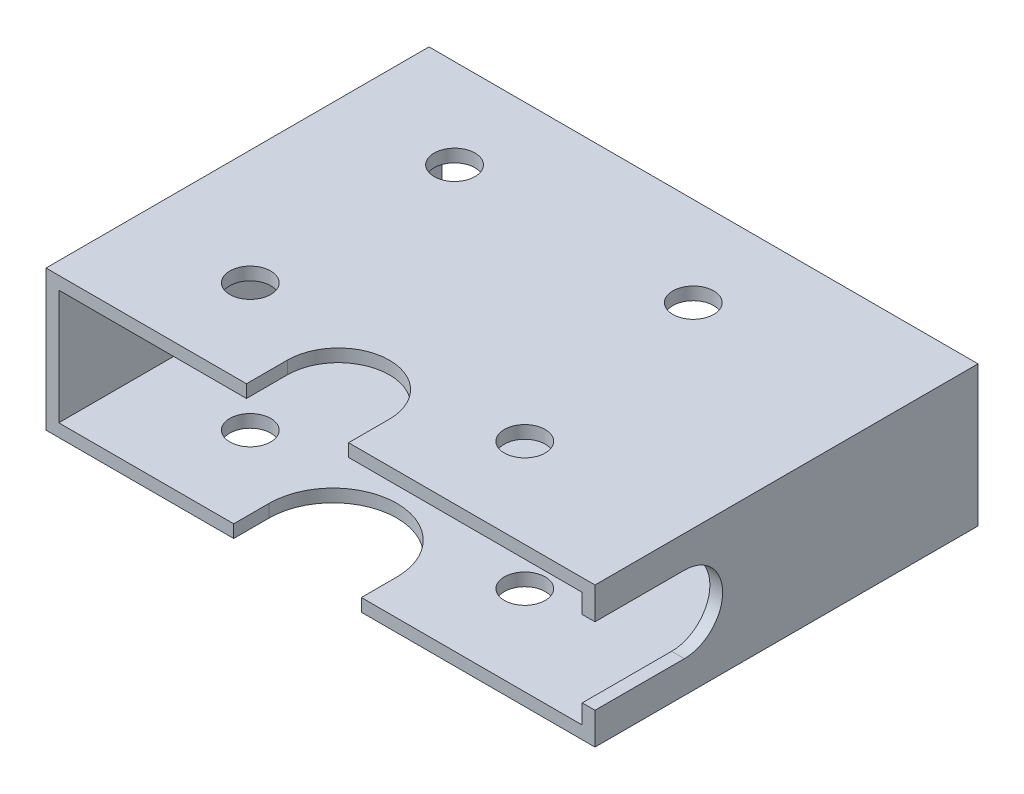
ISO-10303-21;
HEADER;
FILE_DESCRIPTION(('STEP AP214'),'2;1');
FILE_NAME('part.step','',(''),(''),'','','');
FILE_SCHEMA(('AUTOMOTIVE_DESIGN { 1 0 10303 214 1 1 1 1 }'));
ENDSEC;
DATA;
#1=APPLICATION_CONTEXT('core data for automotive mechanical design processes');
#2=APPLICATION_PROTOCOL_DEFINITION('international standard','automotive_design',2000,#1);
#3=PRODUCT_CONTEXT('',#1,'mechanical');
#4=PRODUCT('Part','Part','',(#3));
#5=PRODUCT_RELATED_PRODUCT_CATEGORY('part','',(#4));
#6=PRODUCT_DEFINITION_FORMATION('','',#4);
#7=PRODUCT_DEFINITION_CONTEXT('part definition',#1,'design');
#8=PRODUCT_DEFINITION('design','',#6,#7);
#9=PRODUCT_DEFINITION_SHAPE('','',#8);
#10=(LENGTH_UNIT() NAMED_UNIT(*) SI_UNIT(.MILLI.,.METRE.));
#11=(NAMED_UNIT(*) PLANE_ANGLE_UNIT() SI_UNIT($,.RADIAN.));
#12=(NAMED_UNIT(*) SI_UNIT($,.STERADIAN.) SOLID_ANGLE_UNIT());
#13=UNCERTAINTY_MEASURE_WITH_UNIT(LENGTH_MEASURE(1.E-05),#10,'distance_accuracy_value','');
#14=(GEOMETRIC_REPRESENTATION_CONTEXT(3) GLOBAL_UNCERTAINTY_ASSIGNED_CONTEXT((#13)) GLOBAL_UNIT_ASSIGNED_CONTEXT((#10,
#11,#12)) REPRESENTATION_CONTEXT('',''));
#15=CARTESIAN_POINT('',(0.,0.,0.));
#16=DIRECTION('',(0.,0.,1.));
#17=DIRECTION('',(1.,0.,0.));
#18=AXIS2_PLACEMENT_3D('',#15,#16,#17);
#19=CARTESIAN_POINT('',(0.,0.,30.));
#20=DIRECTION('',(0.,0.,-1.));
#21=DIRECTION('',(-1.,0.,0.));
#22=AXIS2_PLACEMENT_3D('',#19,#20,#21);
#23=PLANE('',#22);
#24=DIRECTION('',(0.,1.,0.));
#25=VECTOR('',#24,1.);
#26=CARTESIAN_POINT('',(-1.,0.999999999999997,30.));
#27=LINE('',#26,#25);
#28=CARTESIAN_POINT('',(-1.,8.5,30.));
#29=VERTEX_POINT('',#28);
#30=CARTESIAN_POINT('',(-1.,10.,30.));
#31=VERTEX_POINT('',#30);
#32=EDGE_CURVE('E273',#29,#31,#27,.T.);
#33=ORIENTED_EDGE('',*,*,#32,.F.);
#34=DIRECTION('',(1.,0.,0.));
#35=VECTOR('',#34,1.);
#36=CARTESIAN_POINT('',(-10.,8.5,30.));
#37=LINE('',#36,#35);
#38=CARTESIAN_POINT('',(0.,8.5,30.));
#39=VERTEX_POINT('',#38);
#40=EDGE_CURVE('E490',#29,#39,#37,.T.);
#41=ORIENTED_EDGE('',*,*,#40,.T.);
#42=DIRECTION('',(0.,1.,0.));
#43=VECTOR('',#42,1.);
#44=CARTESIAN_POINT('',(0.,1.,30.));
#45=LINE('',#44,#43);
#46=CARTESIAN_POINT('',(0.,11.,30.));
#47=VERTEX_POINT('',#46);
#48=EDGE_CURVE('E201',#39,#47,#45,.T.);
#49=ORIENTED_EDGE('',*,*,#48,.T.);
#50=DIRECTION('',(-1.,0.,0.));
#51=VECTOR('',#50,1.);
#52=CARTESIAN_POINT('',(-43.,11.,30.));
#53=LINE('',#52,#51);
#54=CARTESIAN_POINT('',(-19.3,11.,30.));
#55=VERTEX_POINT('',#54);
#56=EDGE_CURVE('E203',#47,#55,#53,.T.);
#57=ORIENTED_EDGE('',*,*,#56,.T.);
#58=DIRECTION('',(0.,1.,0.));
#59=VECTOR('',#58,1.);
#60=CARTESIAN_POINT('',(-19.3,9.,30.));
#61=LINE('',#60,#59);
#62=CARTESIAN_POINT('',(-19.3,10.,30.));
#63=VERTEX_POINT('',#62);
#64=EDGE_CURVE('E360',#63,#55,#61,.T.);
#65=ORIENTED_EDGE('',*,*,#64,.F.);
#66=DIRECTION('',(-1.,0.,0.));
#67=VECTOR('',#66,1.);
#68=CARTESIAN_POINT('',(-1.,10.,30.));
#69=LINE('',#68,#67);
#70=EDGE_CURVE('E275',#31,#63,#69,.T.);
#71=ORIENTED_EDGE('',*,*,#70,.F.);
#72=EDGE_LOOP('',(#33,#41,#49,#57,#65,#71));
#73=FACE_BOUND('',#72,.T.);
#74=ADVANCED_FACE('F38',(#73),#23,.F.);
#75=CARTESIAN_POINT('',(0.,0.,30.));
#76=VERTEX_POINT('',#75);
#77=CARTESIAN_POINT('',(0.,2.5,30.));
#78=VERTEX_POINT('',#77);
#79=EDGE_CURVE('E190',#76,#78,#45,.T.);
#80=ORIENTED_EDGE('',*,*,#79,.T.);
#81=DIRECTION('',(1.,0.,0.));
#82=VECTOR('',#81,1.);
#83=CARTESIAN_POINT('',(-10.,2.5,30.));
#84=LINE('',#83,#82);
#85=CARTESIAN_POINT('',(-1.,2.5,30.));
#86=VERTEX_POINT('',#85);
#87=EDGE_CURVE('E173',#86,#78,#84,.T.);
#88=ORIENTED_EDGE('',*,*,#87,.F.);
#89=CARTESIAN_POINT('',(-1.,0.999999999999997,30.));
#90=VERTEX_POINT('',#89);
#91=EDGE_CURVE('E268',#90,#86,#27,.T.);
#92=ORIENTED_EDGE('',*,*,#91,.F.);
#93=DIRECTION('',(1.,0.,0.));
#94=VECTOR('',#93,1.);
#95=CARTESIAN_POINT('',(-42.,0.999999999999995,30.));
#96=LINE('',#95,#94);
#97=CARTESIAN_POINT('',(-18.3,0.999999999999996,30.));
#98=VERTEX_POINT('',#97);
#99=EDGE_CURVE('E285',#98,#90,#96,.T.);
#100=ORIENTED_EDGE('',*,*,#99,.F.);
#101=DIRECTION('',(0.,1.,0.));
#102=VECTOR('',#101,1.);
#103=CARTESIAN_POINT('',(-18.3,-9.00000000000001,30.));
#104=LINE('',#103,#102);
#105=CARTESIAN_POINT('',(-18.3,0.,30.));
#106=VERTEX_POINT('',#105);
#107=EDGE_CURVE('E319',#106,#98,#104,.T.);
#108=ORIENTED_EDGE('',*,*,#107,.F.);
#109=DIRECTION('',(1.,0.,0.));
#110=VECTOR('',#109,1.);
#111=CARTESIAN_POINT('',(0.,0.,30.));
#112=LINE('',#111,#110);
#113=EDGE_CURVE('E198',#106,#76,#112,.T.);
#114=ORIENTED_EDGE('',*,*,#113,.T.);
#115=EDGE_LOOP('',(#80,#88,#92,#100,#108,#114));
#116=FACE_BOUND('',#115,.T.);
#117=ADVANCED_FACE('F195',(#116),#23,.F.);
#118=CARTESIAN_POINT('',(-43.,0.,30.));
#119=VERTEX_POINT('',#118);
#120=CARTESIAN_POINT('',(-28.3,0.,30.));
#121=VERTEX_POINT('',#120);
#122=EDGE_CURVE('E213',#119,#121,#112,.T.);
#123=ORIENTED_EDGE('',*,*,#122,.T.);
#124=DIRECTION('',(0.,1.,0.));
#125=VECTOR('',#124,1.);
#126=CARTESIAN_POINT('',(-28.3,-9.00000000000001,30.));
#127=LINE('',#126,#125);
#128=CARTESIAN_POINT('',(-28.3,0.999999999999996,30.));
#129=VERTEX_POINT('',#128);
#130=EDGE_CURVE('E322',#121,#129,#127,.T.);
#131=ORIENTED_EDGE('',*,*,#130,.T.);
#132=CARTESIAN_POINT('',(-42.,0.999999999999995,30.));
#133=VERTEX_POINT('',#132);
#134=EDGE_CURVE('E286',#133,#129,#96,.T.);
#135=ORIENTED_EDGE('',*,*,#134,.F.);
#136=DIRECTION('',(0.,-1.,0.));
#137=VECTOR('',#136,1.);
#138=CARTESIAN_POINT('',(-42.,9.99999999999999,30.));
#139=LINE('',#138,#137);
#140=CARTESIAN_POINT('',(-42.,9.99999999999999,30.));
#141=VERTEX_POINT('',#140);
#142=EDGE_CURVE('E282',#141,#133,#139,.T.);
#143=ORIENTED_EDGE('',*,*,#142,.F.);
#144=CARTESIAN_POINT('',(-27.3,10.,30.));
#145=VERTEX_POINT('',#144);
#146=EDGE_CURVE('E272',#145,#141,#69,.T.);
#147=ORIENTED_EDGE('',*,*,#146,.F.);
#148=DIRECTION('',(0.,1.,0.));
#149=VECTOR('',#148,1.);
#150=CARTESIAN_POINT('',(-27.3,8.99999999999999,30.));
#151=LINE('',#150,#149);
#152=CARTESIAN_POINT('',(-27.3,11.,30.));
#153=VERTEX_POINT('',#152);
#154=EDGE_CURVE('E353',#145,#153,#151,.T.);
#155=ORIENTED_EDGE('',*,*,#154,.T.);
#156=CARTESIAN_POINT('',(-43.,11.,30.));
#157=VERTEX_POINT('',#156);
#158=EDGE_CURVE('E200',#153,#157,#53,.T.);
#159=ORIENTED_EDGE('',*,*,#158,.T.);
#160=DIRECTION('',(0.,-1.,0.));
#161=VECTOR('',#160,1.);
#162=CARTESIAN_POINT('',(-43.,0.,30.));
#163=LINE('',#162,#161);
#164=EDGE_CURVE('E211',#157,#119,#163,.T.);
#165=ORIENTED_EDGE('',*,*,#164,.T.);
#166=EDGE_LOOP('',(#123,#131,#135,#143,#147,#155,#159,#165));
#167=FACE_BOUND('',#166,.T.);
#168=ADVANCED_FACE('F349',(#167),#23,.F.);
#169=CARTESIAN_POINT('',(0.,0.,0.));
#170=DIRECTION('',(0.,0.,-1.));
#171=DIRECTION('',(-1.,0.,0.));
#172=AXIS2_PLACEMENT_3D('',#169,#170,#171);
#173=PLANE('',#172);
#174=DIRECTION('',(0.,1.,0.));
#175=VECTOR('',#174,1.);
#176=CARTESIAN_POINT('',(0.,11.,0.));
#177=LINE('',#176,#175);
#178=CARTESIAN_POINT('',(0.,0.,0.));
#179=VERTEX_POINT('',#178);
#180=CARTESIAN_POINT('',(0.,11.,0.));
#181=VERTEX_POINT('',#180);
#182=EDGE_CURVE('E217',#179,#181,#177,.T.);
#183=ORIENTED_EDGE('',*,*,#182,.F.);
#184=DIRECTION('',(1.,0.,0.));
#185=VECTOR('',#184,1.);
#186=CARTESIAN_POINT('',(0.,0.,0.));
#187=LINE('',#186,#185);
#188=CARTESIAN_POINT('',(-43.,0.,0.));
#189=VERTEX_POINT('',#188);
#190=EDGE_CURVE('E205',#189,#179,#187,.T.);
#191=ORIENTED_EDGE('',*,*,#190,.F.);
#192=DIRECTION('',(0.,-1.,0.));
#193=VECTOR('',#192,1.);
#194=CARTESIAN_POINT('',(-43.,0.,0.));
#195=LINE('',#194,#193);
#196=CARTESIAN_POINT('',(-43.,11.,0.));
#197=VERTEX_POINT('',#196);
#198=EDGE_CURVE('E221',#197,#189,#195,.T.);
#199=ORIENTED_EDGE('',*,*,#198,.F.);
#200=DIRECTION('',(-1.,0.,0.));
#201=VECTOR('',#200,1.);
#202=CARTESIAN_POINT('',(-43.,11.,0.));
#203=LINE('',#202,#201);
#204=EDGE_CURVE('E219',#181,#197,#203,.T.);
#205=ORIENTED_EDGE('',*,*,#204,.F.);
#206=EDGE_LOOP('',(#183,#191,#199,#205));
#207=FACE_BOUND('',#206,.T.);
#208=DIRECTION('',(1.,0.,0.));
#209=VECTOR('',#208,1.);
#210=CARTESIAN_POINT('',(-42.,0.999999999999995,0.));
#211=LINE('',#210,#209);
#212=CARTESIAN_POINT('',(-42.,0.999999999999995,0.));
#213=VERTEX_POINT('',#212);
#214=CARTESIAN_POINT('',(-1.,0.999999999999997,0.));
#215=VERTEX_POINT('',#214);
#216=EDGE_CURVE('E277',#213,#215,#211,.T.);
#217=ORIENTED_EDGE('',*,*,#216,.T.);
#218=DIRECTION('',(0.,1.,0.));
#219=VECTOR('',#218,1.);
#220=CARTESIAN_POINT('',(-1.,0.999999999999997,0.));
#221=LINE('',#220,#219);
#222=CARTESIAN_POINT('',(-1.,10.,0.));
#223=VERTEX_POINT('',#222);
#224=EDGE_CURVE('E289',#215,#223,#221,.T.);
#225=ORIENTED_EDGE('',*,*,#224,.T.);
#226=DIRECTION('',(-1.,0.,0.));
#227=VECTOR('',#226,1.);
#228=CARTESIAN_POINT('',(-1.,10.,0.));
#229=LINE('',#228,#227);
#230=CARTESIAN_POINT('',(-42.,9.99999999999999,0.));
#231=VERTEX_POINT('',#230);
#232=EDGE_CURVE('E292',#223,#231,#229,.T.);
#233=ORIENTED_EDGE('',*,*,#232,.T.);
#234=DIRECTION('',(0.,-1.,0.));
#235=VECTOR('',#234,1.);
#236=CARTESIAN_POINT('',(-42.,9.99999999999999,0.));
#237=LINE('',#236,#235);
#238=EDGE_CURVE('E295',#231,#213,#237,.T.);
#239=ORIENTED_EDGE('',*,*,#238,.T.);
#240=EDGE_LOOP('',(#217,#225,#233,#239));
#241=FACE_BOUND('',#240,.T.);
#242=ADVANCED_FACE('F311',(#207,#241),#173,.T.);
#243=CARTESIAN_POINT('',(0.,11.,30.));
#244=DIRECTION('',(-1.,0.,0.));
#245=DIRECTION('',(0.,-1.,0.));
#246=AXIS2_PLACEMENT_3D('',#243,#244,#245);
#247=PLANE('',#246);
#248=ORIENTED_EDGE('',*,*,#48,.F.);
#249=DIRECTION('',(0.,0.,1.));
#250=VECTOR('',#249,1.);
#251=CARTESIAN_POINT('',(0.,8.5,23.));
#252=LINE('',#251,#250);
#253=CARTESIAN_POINT('',(0.,8.5,23.));
#254=VERTEX_POINT('',#253);
#255=EDGE_CURVE('E184',#254,#39,#252,.T.);
#256=ORIENTED_EDGE('',*,*,#255,.F.);
#257=CARTESIAN_POINT('',(0.,5.5,23.));
#258=DIRECTION('',(1.,0.,0.));
#259=DIRECTION('',(0.,1.,0.));
#260=AXIS2_PLACEMENT_3D('',#257,#258,#259);
#261=CIRCLE('',#260,3.);
#262=CARTESIAN_POINT('',(0.,2.5,23.));
#263=VERTEX_POINT('',#262);
#264=EDGE_CURVE('E193',#263,#254,#261,.T.);
#265=ORIENTED_EDGE('',*,*,#264,.F.);
#266=DIRECTION('',(0.,0.,-1.));
#267=VECTOR('',#266,1.);
#268=CARTESIAN_POINT('',(0.,2.5,23.));
#269=LINE('',#268,#267);
#270=EDGE_CURVE('E176',#78,#263,#269,.T.);
#271=ORIENTED_EDGE('',*,*,#270,.F.);
#272=ORIENTED_EDGE('',*,*,#79,.F.);
#273=DIRECTION('',(0.,0.,-1.));
#274=VECTOR('',#273,1.);
#275=CARTESIAN_POINT('',(0.,0.,30.));
#276=LINE('',#275,#274);
#277=EDGE_CURVE('E216',#76,#179,#276,.T.);
#278=ORIENTED_EDGE('',*,*,#277,.T.);
#279=ORIENTED_EDGE('',*,*,#182,.T.);
#280=DIRECTION('',(0.,0.,-1.));
#281=VECTOR('',#280,1.);
#282=CARTESIAN_POINT('',(0.,11.,30.));
#283=LINE('',#282,#281);
#284=EDGE_CURVE('E232',#47,#181,#283,.T.);
#285=ORIENTED_EDGE('',*,*,#284,.F.);
#286=EDGE_LOOP('',(#248,#256,#265,#271,#272,#278,#279,#285));
#287=FACE_BOUND('',#286,.T.);
#288=ADVANCED_FACE('F40',(#287),#247,.F.);
#289=CARTESIAN_POINT('',(-43.,11.,30.));
#290=DIRECTION('',(0.,-1.,0.));
#291=DIRECTION('',(1.,0.,0.));
#292=AXIS2_PLACEMENT_3D('',#289,#290,#291);
#293=PLANE('',#292);
#294=CARTESIAN_POINT('',(-15.3,11.,7.));
#295=DIRECTION('',(0.,1.,0.));
#296=DIRECTION('',(0.,0.,-1.));
#297=AXIS2_PLACEMENT_3D('',#294,#295,#296);
#298=CIRCLE('',#297,1.6);
#299=CARTESIAN_POINT('',(-15.3,11.,5.4));
#300=VERTEX_POINT('',#299);
#301=EDGE_CURVE('E369',#300,#300,#298,.T.);
#302=ORIENTED_EDGE('',*,*,#301,.F.);
#303=EDGE_LOOP('',(#302));
#304=FACE_BOUND('',#303,.T.);
#305=CARTESIAN_POINT('',(-12.5,11.,23.));
#306=DIRECTION('',(0.,1.,0.));
#307=DIRECTION('',(0.,0.,1.));
#308=AXIS2_PLACEMENT_3D('',#305,#306,#307);
#309=CIRCLE('',#308,1.6);
#310=CARTESIAN_POINT('',(-12.5,11.,24.6));
#311=VERTEX_POINT('',#310);
#312=EDGE_CURVE('E383',#311,#311,#309,.T.);
#313=ORIENTED_EDGE('',*,*,#312,.F.);
#314=EDGE_LOOP('',(#313));
#315=FACE_BOUND('',#314,.T.);
#316=CARTESIAN_POINT('',(-34.,11.,23.));
#317=DIRECTION('',(0.,1.,0.));
#318=DIRECTION('',(0.,0.,1.));
#319=AXIS2_PLACEMENT_3D('',#316,#317,#318);
#320=CIRCLE('',#319,1.6);
#321=CARTESIAN_POINT('',(-34.,11.,24.6));
#322=VERTEX_POINT('',#321);
#323=EDGE_CURVE('E377',#322,#322,#320,.T.);
#324=ORIENTED_EDGE('',*,*,#323,.F.);
#325=EDGE_LOOP('',(#324));
#326=FACE_BOUND('',#325,.T.);
#327=CARTESIAN_POINT('',(-34.,11.,7.));
#328=DIRECTION('',(0.,1.,0.));
#329=DIRECTION('',(0.,0.,1.));
#330=AXIS2_PLACEMENT_3D('',#327,#328,#329);
#331=CIRCLE('',#330,1.60000000000001);
#332=CARTESIAN_POINT('',(-34.,11.,8.6));
#333=VERTEX_POINT('',#332);
#334=EDGE_CURVE('E376',#333,#333,#331,.T.);
#335=ORIENTED_EDGE('',*,*,#334,.F.);
#336=EDGE_LOOP('',(#335));
#337=FACE_BOUND('',#336,.T.);
#338=ORIENTED_EDGE('',*,*,#158,.F.);
#339=DIRECTION('',(0.,0.,1.));
#340=VECTOR('',#339,1.);
#341=CARTESIAN_POINT('',(-27.3,11.,30.));
#342=LINE('',#341,#340);
#343=CARTESIAN_POINT('',(-27.3,11.,26.8));
#344=VERTEX_POINT('',#343);
#345=EDGE_CURVE('E356',#344,#153,#342,.T.);
#346=ORIENTED_EDGE('',*,*,#345,.F.);
#347=CARTESIAN_POINT('',(-23.3,11.,26.8));
#348=DIRECTION('',(0.,1.,0.));
#349=DIRECTION('',(1.,0.,0.));
#350=AXIS2_PLACEMENT_3D('',#347,#348,#349);
#351=CIRCLE('',#350,4.);
#352=CARTESIAN_POINT('',(-19.3,11.,26.8));
#353=VERTEX_POINT('',#352);
#354=EDGE_CURVE('E358',#353,#344,#351,.T.);
#355=ORIENTED_EDGE('',*,*,#354,.F.);
#356=DIRECTION('',(0.,0.,-1.));
#357=VECTOR('',#356,1.);
#358=CARTESIAN_POINT('',(-19.3,11.,30.));
#359=LINE('',#358,#357);
#360=EDGE_CURVE('E364',#55,#353,#359,.T.);
#361=ORIENTED_EDGE('',*,*,#360,.F.);
#362=ORIENTED_EDGE('',*,*,#56,.F.);
#363=ORIENTED_EDGE('',*,*,#284,.T.);
#364=ORIENTED_EDGE('',*,*,#204,.T.);
#365=DIRECTION('',(0.,0.,-1.));
#366=VECTOR('',#365,1.);
#367=CARTESIAN_POINT('',(-43.,11.,30.));
#368=LINE('',#367,#366);
#369=EDGE_CURVE('E229',#157,#197,#368,.T.);
#370=ORIENTED_EDGE('',*,*,#369,.F.);
#371=EDGE_LOOP('',(#338,#346,#355,#361,#362,#363,#364,#370));
#372=FACE_BOUND('',#371,.T.);
#373=ADVANCED_FACE('F336',(#304,#315,#326,#337,#372),#293,.F.);
#374=CARTESIAN_POINT('',(-43.,0.,30.));
#375=DIRECTION('',(1.,0.,0.));
#376=DIRECTION('',(0.,0.,-1.));
#377=AXIS2_PLACEMENT_3D('',#374,#375,#376);
#378=PLANE('',#377);
#379=ORIENTED_EDGE('',*,*,#198,.T.);
#380=DIRECTION('',(0.,0.,-1.));
#381=VECTOR('',#380,1.);
#382=CARTESIAN_POINT('',(-43.,0.,30.));
#383=LINE('',#382,#381);
#384=EDGE_CURVE('E226',#119,#189,#383,.T.);
#385=ORIENTED_EDGE('',*,*,#384,.F.);
#386=ORIENTED_EDGE('',*,*,#164,.F.);
#387=ORIENTED_EDGE('',*,*,#369,.T.);
#388=EDGE_LOOP('',(#379,#385,#386,#387));
#389=FACE_BOUND('',#388,.T.);
#390=ADVANCED_FACE('F342',(#389),#378,.F.);
#391=CARTESIAN_POINT('',(0.,0.,30.));
#392=DIRECTION('',(0.,1.,0.));
#393=DIRECTION('',(-1.,0.,0.));
#394=AXIS2_PLACEMENT_3D('',#391,#392,#393);
#395=PLANE('',#394);
#396=CARTESIAN_POINT('',(-15.3,0.,7.));
#397=DIRECTION('',(0.,1.,0.));
#398=DIRECTION('',(0.,0.,-1.));
#399=AXIS2_PLACEMENT_3D('',#396,#397,#398);
#400=CIRCLE('',#399,1.6);
#401=CARTESIAN_POINT('',(-15.3,0.,5.4));
#402=VERTEX_POINT('',#401);
#403=EDGE_CURVE('E386',#402,#402,#400,.T.);
#404=ORIENTED_EDGE('',*,*,#403,.T.);
#405=EDGE_LOOP('',(#404));
#406=FACE_BOUND('',#405,.T.);
#407=CARTESIAN_POINT('',(-12.5,0.,23.));
#408=DIRECTION('',(0.,1.,0.));
#409=DIRECTION('',(0.,0.,1.));
#410=AXIS2_PLACEMENT_3D('',#407,#408,#409);
#411=CIRCLE('',#410,1.6);
#412=CARTESIAN_POINT('',(-12.5,0.,24.6));
#413=VERTEX_POINT('',#412);
#414=EDGE_CURVE('E380',#413,#413,#411,.T.);
#415=ORIENTED_EDGE('',*,*,#414,.T.);
#416=EDGE_LOOP('',(#415));
#417=FACE_BOUND('',#416,.T.);
#418=CARTESIAN_POINT('',(-34.,0.,23.));
#419=DIRECTION('',(0.,1.,0.));
#420=DIRECTION('',(0.,0.,1.));
#421=AXIS2_PLACEMENT_3D('',#418,#419,#420);
#422=CIRCLE('',#421,1.6);
#423=CARTESIAN_POINT('',(-34.,0.,24.6));
#424=VERTEX_POINT('',#423);
#425=EDGE_CURVE('E373',#424,#424,#422,.T.);
#426=ORIENTED_EDGE('',*,*,#425,.T.);
#427=EDGE_LOOP('',(#426));
#428=FACE_BOUND('',#427,.T.);
#429=CARTESIAN_POINT('',(-34.,0.,7.));
#430=DIRECTION('',(0.,1.,0.));
#431=DIRECTION('',(0.,0.,1.));
#432=AXIS2_PLACEMENT_3D('',#429,#430,#431);
#433=CIRCLE('',#432,1.60000000000001);
#434=CARTESIAN_POINT('',(-34.,0.,8.6));
#435=VERTEX_POINT('',#434);
#436=EDGE_CURVE('E240',#435,#435,#433,.T.);
#437=ORIENTED_EDGE('',*,*,#436,.T.);
#438=EDGE_LOOP('',(#437));
#439=FACE_BOUND('',#438,.T.);
#440=ORIENTED_EDGE('',*,*,#113,.F.);
#441=DIRECTION('',(0.,0.,-1.));
#442=VECTOR('',#441,1.);
#443=CARTESIAN_POINT('',(-18.3,0.,30.));
#444=LINE('',#443,#442);
#445=CARTESIAN_POINT('',(-18.3,0.,27.2207204187685));
#446=VERTEX_POINT('',#445);
#447=EDGE_CURVE('E328',#106,#446,#444,.T.);
#448=ORIENTED_EDGE('',*,*,#447,.T.);
#449=CARTESIAN_POINT('',(-23.3,0.,27.2207204187685));
#450=DIRECTION('',(0.,1.,0.));
#451=DIRECTION('',(-1.,0.,0.));
#452=AXIS2_PLACEMENT_3D('',#449,#450,#451);
#453=CIRCLE('',#452,5.);
#454=CARTESIAN_POINT('',(-28.3,0.,27.2207204187685));
#455=VERTEX_POINT('',#454);
#456=EDGE_CURVE('E498',#446,#455,#453,.T.);
#457=ORIENTED_EDGE('',*,*,#456,.T.);
#458=DIRECTION('',(0.,0.,1.));
#459=VECTOR('',#458,1.);
#460=CARTESIAN_POINT('',(-28.3,0.,30.));
#461=LINE('',#460,#459);
#462=EDGE_CURVE('E346',#455,#121,#461,.T.);
#463=ORIENTED_EDGE('',*,*,#462,.T.);
#464=ORIENTED_EDGE('',*,*,#122,.F.);
#465=ORIENTED_EDGE('',*,*,#384,.T.);
#466=ORIENTED_EDGE('',*,*,#190,.T.);
#467=ORIENTED_EDGE('',*,*,#277,.F.);
#468=EDGE_LOOP('',(#440,#448,#457,#463,#464,#465,#466,#467));
#469=FACE_BOUND('',#468,.T.);
#470=ADVANCED_FACE('F326',(#406,#417,#428,#439,#469),#395,.F.);
#471=CARTESIAN_POINT('',(-1.,0.999999999999997,30.));
#472=DIRECTION('',(-1.,0.,0.));
#473=DIRECTION('',(0.,-1.,0.));
#474=AXIS2_PLACEMENT_3D('',#471,#472,#473);
#475=PLANE('',#474);
#476=DIRECTION('',(0.,0.,-1.));
#477=VECTOR('',#476,1.);
#478=CARTESIAN_POINT('',(-1.,8.5,30.));
#479=LINE('',#478,#477);
#480=CARTESIAN_POINT('',(-1.,8.5,23.));
#481=VERTEX_POINT('',#480);
#482=EDGE_CURVE('E11',#29,#481,#479,.T.);
#483=ORIENTED_EDGE('',*,*,#482,.F.);
#484=ORIENTED_EDGE('',*,*,#32,.T.);
#485=DIRECTION('',(0.,0.,-1.));
#486=VECTOR('',#485,1.);
#487=CARTESIAN_POINT('',(-1.,10.,30.));
#488=LINE('',#487,#486);
#489=EDGE_CURVE('E207',#31,#223,#488,.T.);
#490=ORIENTED_EDGE('',*,*,#489,.T.);
#491=ORIENTED_EDGE('',*,*,#224,.F.);
#492=DIRECTION('',(0.,0.,-1.));
#493=VECTOR('',#492,1.);
#494=CARTESIAN_POINT('',(-1.,0.999999999999997,30.));
#495=LINE('',#494,#493);
#496=EDGE_CURVE('E270',#90,#215,#495,.T.);
#497=ORIENTED_EDGE('',*,*,#496,.F.);
#498=ORIENTED_EDGE('',*,*,#91,.T.);
#499=DIRECTION('',(0.,0.,1.));
#500=VECTOR('',#499,1.);
#501=CARTESIAN_POINT('',(-1.,2.5,30.));
#502=LINE('',#501,#500);
#503=CARTESIAN_POINT('',(-1.,2.5,23.));
#504=VERTEX_POINT('',#503);
#505=EDGE_CURVE('E179',#504,#86,#502,.T.);
#506=ORIENTED_EDGE('',*,*,#505,.F.);
#507=CARTESIAN_POINT('',(-1.,5.5,23.));
#508=DIRECTION('',(-1.,0.,0.));
#509=DIRECTION('',(0.,-1.,0.));
#510=AXIS2_PLACEMENT_3D('',#507,#508,#509);
#511=CIRCLE('',#510,3.);
#512=EDGE_CURVE('E46',#481,#504,#511,.T.);
#513=ORIENTED_EDGE('',*,*,#512,.F.);
#514=EDGE_LOOP('',(#483,#484,#490,#491,#497,#498,#506,#513));
#515=FACE_BOUND('',#514,.T.);
#516=ADVANCED_FACE('F266',(#515),#475,.T.);
#517=CARTESIAN_POINT('',(-1.,10.,30.));
#518=DIRECTION('',(0.,-1.,0.));
#519=DIRECTION('',(1.,0.,0.));
#520=AXIS2_PLACEMENT_3D('',#517,#518,#519);
#521=PLANE('',#520);
#522=DIRECTION('',(0.,0.,-1.));
#523=VECTOR('',#522,1.);
#524=CARTESIAN_POINT('',(-27.3,10.,30.));
#525=LINE('',#524,#523);
#526=CARTESIAN_POINT('',(-27.3,10.,26.8));
#527=VERTEX_POINT('',#526);
#528=EDGE_CURVE('E257',#145,#527,#525,.T.);
#529=ORIENTED_EDGE('',*,*,#528,.F.);
#530=ORIENTED_EDGE('',*,*,#146,.T.);
#531=DIRECTION('',(0.,0.,-1.));
#532=VECTOR('',#531,1.);
#533=CARTESIAN_POINT('',(-42.,9.99999999999999,30.));
#534=LINE('',#533,#532);
#535=EDGE_CURVE('E302',#141,#231,#534,.T.);
#536=ORIENTED_EDGE('',*,*,#535,.T.);
#537=ORIENTED_EDGE('',*,*,#232,.F.);
#538=ORIENTED_EDGE('',*,*,#489,.F.);
#539=ORIENTED_EDGE('',*,*,#70,.T.);
#540=DIRECTION('',(0.,0.,1.));
#541=VECTOR('',#540,1.);
#542=CARTESIAN_POINT('',(-19.3,10.,30.));
#543=LINE('',#542,#541);
#544=CARTESIAN_POINT('',(-19.3,10.,26.8));
#545=VERTEX_POINT('',#544);
#546=EDGE_CURVE('E235',#545,#63,#543,.T.);
#547=ORIENTED_EDGE('',*,*,#546,.F.);
#548=CARTESIAN_POINT('',(-23.3,10.,26.8));
#549=DIRECTION('',(0.,-1.,0.));
#550=DIRECTION('',(1.,0.,0.));
#551=AXIS2_PLACEMENT_3D('',#548,#549,#550);
#552=CIRCLE('',#551,4.);
#553=EDGE_CURVE('E254',#527,#545,#552,.T.);
#554=ORIENTED_EDGE('',*,*,#553,.F.);
#555=EDGE_LOOP('',(#529,#530,#536,#537,#538,#539,#547,#554));
#556=FACE_BOUND('',#555,.T.);
#557=CARTESIAN_POINT('',(-15.3,10.,7.));
#558=DIRECTION('',(0.,-1.,0.));
#559=DIRECTION('',(1.,0.,0.));
#560=AXIS2_PLACEMENT_3D('',#557,#558,#559);
#561=CIRCLE('',#560,1.6);
#562=CARTESIAN_POINT('',(-13.7,10.,7.));
#563=VERTEX_POINT('',#562);
#564=EDGE_CURVE('E252',#563,#563,#561,.T.);
#565=ORIENTED_EDGE('',*,*,#564,.F.);
#566=EDGE_LOOP('',(#565));
#567=FACE_BOUND('',#566,.T.);
#568=CARTESIAN_POINT('',(-12.5,10.,23.));
#569=DIRECTION('',(0.,-1.,0.));
#570=DIRECTION('',(1.,0.,0.));
#571=AXIS2_PLACEMENT_3D('',#568,#569,#570);
#572=CIRCLE('',#571,1.6);
#573=CARTESIAN_POINT('',(-10.9,10.,23.));
#574=VERTEX_POINT('',#573);
#575=EDGE_CURVE('E248',#574,#574,#572,.T.);
#576=ORIENTED_EDGE('',*,*,#575,.F.);
#577=EDGE_LOOP('',(#576));
#578=FACE_BOUND('',#577,.T.);
#579=CARTESIAN_POINT('',(-34.,9.99999999999999,23.));
#580=DIRECTION('',(0.,-1.,0.));
#581=DIRECTION('',(1.,0.,0.));
#582=AXIS2_PLACEMENT_3D('',#579,#580,#581);
#583=CIRCLE('',#582,1.6);
#584=CARTESIAN_POINT('',(-32.4,9.99999999999999,23.));
#585=VERTEX_POINT('',#584);
#586=EDGE_CURVE('E244',#585,#585,#583,.T.);
#587=ORIENTED_EDGE('',*,*,#586,.F.);
#588=EDGE_LOOP('',(#587));
#589=FACE_BOUND('',#588,.T.);
#590=CARTESIAN_POINT('',(-34.,9.99999999999999,7.));
#591=DIRECTION('',(0.,-1.,0.));
#592=DIRECTION('',(1.,0.,0.));
#593=AXIS2_PLACEMENT_3D('',#590,#591,#592);
#594=CIRCLE('',#593,1.60000000000001);
#595=CARTESIAN_POINT('',(-32.4,9.99999999999999,7.));
#596=VERTEX_POINT('',#595);
#597=EDGE_CURVE('E239',#596,#596,#594,.T.);
#598=ORIENTED_EDGE('',*,*,#597,.F.);
#599=EDGE_LOOP('',(#598));
#600=FACE_BOUND('',#599,.T.);
#601=ADVANCED_FACE('F404',(#556,#567,#578,#589,#600),#521,.T.);
#602=CARTESIAN_POINT('',(-42.,9.99999999999999,30.));
#603=DIRECTION('',(1.,0.,0.));
#604=DIRECTION('',(0.,0.,-1.));
#605=AXIS2_PLACEMENT_3D('',#602,#603,#604);
#606=PLANE('',#605);
#607=ORIENTED_EDGE('',*,*,#238,.F.);
#608=ORIENTED_EDGE('',*,*,#535,.F.);
#609=ORIENTED_EDGE('',*,*,#142,.T.);
#610=DIRECTION('',(0.,0.,-1.));
#611=VECTOR('',#610,1.);
#612=CARTESIAN_POINT('',(-42.,0.999999999999995,30.));
#613=LINE('',#612,#611);
#614=EDGE_CURVE('E301',#133,#213,#613,.T.);
#615=ORIENTED_EDGE('',*,*,#614,.T.);
#616=EDGE_LOOP('',(#607,#608,#609,#615));
#617=FACE_BOUND('',#616,.T.);
#618=ADVANCED_FACE('F407',(#617),#606,.T.);
#619=CARTESIAN_POINT('',(-42.,0.999999999999995,30.));
#620=DIRECTION('',(0.,1.,0.));
#621=DIRECTION('',(-1.,0.,0.));
#622=AXIS2_PLACEMENT_3D('',#619,#620,#621);
#623=PLANE('',#622);
#624=DIRECTION('',(0.,0.,-1.));
#625=VECTOR('',#624,1.);
#626=CARTESIAN_POINT('',(-18.3,0.999999999999996,27.2207204187685));
#627=LINE('',#626,#625);
#628=CARTESIAN_POINT('',(-18.3,0.999999999999996,27.2207204187685));
#629=VERTEX_POINT('',#628);
#630=EDGE_CURVE('E318',#98,#629,#627,.T.);
#631=ORIENTED_EDGE('',*,*,#630,.F.);
#632=ORIENTED_EDGE('',*,*,#99,.T.);
#633=ORIENTED_EDGE('',*,*,#496,.T.);
#634=ORIENTED_EDGE('',*,*,#216,.F.);
#635=ORIENTED_EDGE('',*,*,#614,.F.);
#636=ORIENTED_EDGE('',*,*,#134,.T.);
#637=DIRECTION('',(0.,0.,1.));
#638=VECTOR('',#637,1.);
#639=CARTESIAN_POINT('',(-28.3,0.999999999999996,27.2207204187685));
#640=LINE('',#639,#638);
#641=CARTESIAN_POINT('',(-28.3,0.999999999999996,27.2207204187685));
#642=VERTEX_POINT('',#641);
#643=EDGE_CURVE('E485',#642,#129,#640,.T.);
#644=ORIENTED_EDGE('',*,*,#643,.F.);
#645=CARTESIAN_POINT('',(-23.3,0.999999999999996,27.2207204187685));
#646=DIRECTION('',(0.,1.,0.));
#647=DIRECTION('',(-1.,0.,0.));
#648=AXIS2_PLACEMENT_3D('',#645,#646,#647);
#649=CIRCLE('',#648,5.);
#650=EDGE_CURVE('E61',#629,#642,#649,.T.);
#651=ORIENTED_EDGE('',*,*,#650,.F.);
#652=EDGE_LOOP('',(#631,#632,#633,#634,#635,#636,#644,#651));
#653=FACE_BOUND('',#652,.T.);
#654=CARTESIAN_POINT('',(-15.3,0.999999999999996,7.));
#655=DIRECTION('',(0.,1.,0.));
#656=DIRECTION('',(-1.,0.,0.));
#657=AXIS2_PLACEMENT_3D('',#654,#655,#656);
#658=CIRCLE('',#657,1.6);
#659=CARTESIAN_POINT('',(-16.9,0.999999999999996,7.));
#660=VERTEX_POINT('',#659);
#661=EDGE_CURVE('E249',#660,#660,#658,.T.);
#662=ORIENTED_EDGE('',*,*,#661,.F.);
#663=EDGE_LOOP('',(#662));
#664=FACE_BOUND('',#663,.T.);
#665=CARTESIAN_POINT('',(-12.5,0.999999999999996,23.));
#666=DIRECTION('',(0.,1.,0.));
#667=DIRECTION('',(-1.,0.,0.));
#668=AXIS2_PLACEMENT_3D('',#665,#666,#667);
#669=CIRCLE('',#668,1.6);
#670=CARTESIAN_POINT('',(-14.1,0.999999999999996,23.));
#671=VERTEX_POINT('',#670);
#672=EDGE_CURVE('E245',#671,#671,#669,.T.);
#673=ORIENTED_EDGE('',*,*,#672,.F.);
#674=EDGE_LOOP('',(#673));
#675=FACE_BOUND('',#674,.T.);
#676=CARTESIAN_POINT('',(-34.,0.999999999999995,23.));
#677=DIRECTION('',(0.,1.,0.));
#678=DIRECTION('',(-1.,0.,0.));
#679=AXIS2_PLACEMENT_3D('',#676,#677,#678);
#680=CIRCLE('',#679,1.6);
#681=CARTESIAN_POINT('',(-35.6,0.999999999999995,23.));
#682=VERTEX_POINT('',#681);
#683=EDGE_CURVE('E241',#682,#682,#680,.T.);
#684=ORIENTED_EDGE('',*,*,#683,.F.);
#685=EDGE_LOOP('',(#684));
#686=FACE_BOUND('',#685,.T.);
#687=CARTESIAN_POINT('',(-34.,0.999999999999995,7.));
#688=DIRECTION('',(0.,1.,0.));
#689=DIRECTION('',(-1.,0.,0.));
#690=AXIS2_PLACEMENT_3D('',#687,#688,#689);
#691=CIRCLE('',#690,1.60000000000001);
#692=CARTESIAN_POINT('',(-35.6,0.999999999999995,7.));
#693=VERTEX_POINT('',#692);
#694=EDGE_CURVE('E236',#693,#693,#691,.T.);
#695=ORIENTED_EDGE('',*,*,#694,.F.);
#696=EDGE_LOOP('',(#695));
#697=FACE_BOUND('',#696,.T.);
#698=ADVANCED_FACE('F315',(#653,#664,#675,#686,#697),#623,.T.);
#699=CARTESIAN_POINT('',(-34.,0.,7.));
#700=DIRECTION('',(0.,1.,0.));
#701=DIRECTION('',(0.,0.,1.));
#702=AXIS2_PLACEMENT_3D('',#699,#700,#701);
#703=CYLINDRICAL_SURFACE('',#702,1.60000000000001);
#704=ORIENTED_EDGE('',*,*,#694,.T.);
#705=EDGE_LOOP('',(#704));
#706=FACE_BOUND('',#705,.T.);
#707=ORIENTED_EDGE('',*,*,#436,.F.);
#708=EDGE_LOOP('',(#707));
#709=FACE_BOUND('',#708,.T.);
#710=ADVANCED_FACE('F419',(#706,#709),#703,.F.);
#711=CARTESIAN_POINT('',(-34.,0.,23.));
#712=DIRECTION('',(0.,1.,0.));
#713=DIRECTION('',(0.,0.,1.));
#714=AXIS2_PLACEMENT_3D('',#711,#712,#713);
#715=CYLINDRICAL_SURFACE('',#714,1.6);
#716=ORIENTED_EDGE('',*,*,#683,.T.);
#717=EDGE_LOOP('',(#716));
#718=FACE_BOUND('',#717,.T.);
#719=ORIENTED_EDGE('',*,*,#425,.F.);
#720=EDGE_LOOP('',(#719));
#721=FACE_BOUND('',#720,.T.);
#722=ADVANCED_FACE('F465',(#718,#721),#715,.F.);
#723=CARTESIAN_POINT('',(-12.5,0.,23.));
#724=DIRECTION('',(0.,1.,0.));
#725=DIRECTION('',(0.,0.,1.));
#726=AXIS2_PLACEMENT_3D('',#723,#724,#725);
#727=CYLINDRICAL_SURFACE('',#726,1.6);
#728=ORIENTED_EDGE('',*,*,#672,.T.);
#729=EDGE_LOOP('',(#728));
#730=FACE_BOUND('',#729,.T.);
#731=ORIENTED_EDGE('',*,*,#414,.F.);
#732=EDGE_LOOP('',(#731));
#733=FACE_BOUND('',#732,.T.);
#734=ADVANCED_FACE('F471',(#730,#733),#727,.F.);
#735=CARTESIAN_POINT('',(-15.3,0.,7.));
#736=DIRECTION('',(0.,1.,0.));
#737=DIRECTION('',(0.,0.,1.));
#738=AXIS2_PLACEMENT_3D('',#735,#736,#737);
#739=CYLINDRICAL_SURFACE('',#738,1.6);
#740=ORIENTED_EDGE('',*,*,#661,.T.);
#741=EDGE_LOOP('',(#740));
#742=FACE_BOUND('',#741,.T.);
#743=ORIENTED_EDGE('',*,*,#403,.F.);
#744=EDGE_LOOP('',(#743));
#745=FACE_BOUND('',#744,.T.);
#746=ADVANCED_FACE('F417',(#742,#745),#739,.F.);
#747=ORIENTED_EDGE('',*,*,#597,.T.);
#748=EDGE_LOOP('',(#747));
#749=FACE_BOUND('',#748,.T.);
#750=ORIENTED_EDGE('',*,*,#334,.T.);
#751=EDGE_LOOP('',(#750));
#752=FACE_BOUND('',#751,.T.);
#753=ADVANCED_FACE('F413',(#749,#752),#703,.F.);
#754=ORIENTED_EDGE('',*,*,#586,.T.);
#755=EDGE_LOOP('',(#754));
#756=FACE_BOUND('',#755,.T.);
#757=ORIENTED_EDGE('',*,*,#323,.T.);
#758=EDGE_LOOP('',(#757));
#759=FACE_BOUND('',#758,.T.);
#760=ADVANCED_FACE('F416',(#756,#759),#715,.F.);
#761=ORIENTED_EDGE('',*,*,#575,.T.);
#762=EDGE_LOOP('',(#761));
#763=FACE_BOUND('',#762,.T.);
#764=ORIENTED_EDGE('',*,*,#312,.T.);
#765=EDGE_LOOP('',(#764));
#766=FACE_BOUND('',#765,.T.);
#767=ADVANCED_FACE('F401',(#763,#766),#727,.F.);
#768=ORIENTED_EDGE('',*,*,#564,.T.);
#769=EDGE_LOOP('',(#768));
#770=FACE_BOUND('',#769,.T.);
#771=ORIENTED_EDGE('',*,*,#301,.T.);
#772=EDGE_LOOP('',(#771));
#773=FACE_BOUND('',#772,.T.);
#774=ADVANCED_FACE('F520',(#770,#773),#739,.F.);
#775=CARTESIAN_POINT('',(-27.3,8.99999999999999,30.));
#776=DIRECTION('',(-1.,0.,0.));
#777=DIRECTION('',(0.,0.,1.));
#778=AXIS2_PLACEMENT_3D('',#775,#776,#777);
#779=PLANE('',#778);
#780=ORIENTED_EDGE('',*,*,#528,.T.);
#781=DIRECTION('',(0.,1.,0.));
#782=VECTOR('',#781,1.);
#783=CARTESIAN_POINT('',(-27.3,8.99999999999999,26.8));
#784=LINE('',#783,#782);
#785=EDGE_CURVE('E370',#527,#344,#784,.T.);
#786=ORIENTED_EDGE('',*,*,#785,.T.);
#787=ORIENTED_EDGE('',*,*,#345,.T.);
#788=ORIENTED_EDGE('',*,*,#154,.F.);
#789=EDGE_LOOP('',(#780,#786,#787,#788));
#790=FACE_BOUND('',#789,.T.);
#791=ADVANCED_FACE('F518',(#790),#779,.F.);
#792=CARTESIAN_POINT('',(-23.3,8.99999999999999,26.8));
#793=DIRECTION('',(0.,1.,0.));
#794=DIRECTION('',(-1.,0.,0.));
#795=AXIS2_PLACEMENT_3D('',#792,#793,#794);
#796=CYLINDRICAL_SURFACE('',#795,4.);
#797=ORIENTED_EDGE('',*,*,#553,.T.);
#798=DIRECTION('',(0.,1.,0.));
#799=VECTOR('',#798,1.);
#800=CARTESIAN_POINT('',(-19.3,8.99999999999999,26.8));
#801=LINE('',#800,#799);
#802=EDGE_CURVE('E362',#545,#353,#801,.T.);
#803=ORIENTED_EDGE('',*,*,#802,.T.);
#804=ORIENTED_EDGE('',*,*,#354,.T.);
#805=ORIENTED_EDGE('',*,*,#785,.F.);
#806=EDGE_LOOP('',(#797,#803,#804,#805));
#807=FACE_BOUND('',#806,.T.);
#808=ADVANCED_FACE('F517',(#807),#796,.F.);
#809=CARTESIAN_POINT('',(-19.3,9.,30.));
#810=DIRECTION('',(1.,0.,0.));
#811=DIRECTION('',(0.,0.,-1.));
#812=AXIS2_PLACEMENT_3D('',#809,#810,#811);
#813=PLANE('',#812);
#814=ORIENTED_EDGE('',*,*,#546,.T.);
#815=ORIENTED_EDGE('',*,*,#64,.T.);
#816=ORIENTED_EDGE('',*,*,#360,.T.);
#817=ORIENTED_EDGE('',*,*,#802,.F.);
#818=EDGE_LOOP('',(#814,#815,#816,#817));
#819=FACE_BOUND('',#818,.T.);
#820=ADVANCED_FACE('F501',(#819),#813,.F.);
#821=CARTESIAN_POINT('',(-23.3,-9.00000000000001,27.2207204187685));
#822=DIRECTION('',(0.,1.,0.));
#823=DIRECTION('',(-1.,0.,0.));
#824=AXIS2_PLACEMENT_3D('',#821,#822,#823);
#825=CYLINDRICAL_SURFACE('',#824,5.);
#826=DIRECTION('',(0.,1.,0.));
#827=VECTOR('',#826,1.);
#828=CARTESIAN_POINT('',(-18.3,-9.00000000000001,27.2207204187685));
#829=LINE('',#828,#827);
#830=EDGE_CURVE('E321',#446,#629,#829,.T.);
#831=ORIENTED_EDGE('',*,*,#830,.T.);
#832=ORIENTED_EDGE('',*,*,#650,.T.);
#833=DIRECTION('',(0.,1.,0.));
#834=VECTOR('',#833,1.);
#835=CARTESIAN_POINT('',(-28.3,-9.00000000000001,27.2207204187685));
#836=LINE('',#835,#834);
#837=EDGE_CURVE('E488',#455,#642,#836,.T.);
#838=ORIENTED_EDGE('',*,*,#837,.F.);
#839=ORIENTED_EDGE('',*,*,#456,.F.);
#840=EDGE_LOOP('',(#831,#832,#838,#839));
#841=FACE_BOUND('',#840,.T.);
#842=ADVANCED_FACE('F530',(#841),#825,.F.);
#843=CARTESIAN_POINT('',(-18.3,-9.00000000000001,27.2207204187685));
#844=DIRECTION('',(1.,0.,0.));
#845=DIRECTION('',(0.,0.,-1.));
#846=AXIS2_PLACEMENT_3D('',#843,#844,#845);
#847=PLANE('',#846);
#848=ORIENTED_EDGE('',*,*,#107,.T.);
#849=ORIENTED_EDGE('',*,*,#630,.T.);
#850=ORIENTED_EDGE('',*,*,#830,.F.);
#851=ORIENTED_EDGE('',*,*,#447,.F.);
#852=EDGE_LOOP('',(#848,#849,#850,#851));
#853=FACE_BOUND('',#852,.T.);
#854=ADVANCED_FACE('F645',(#853),#847,.F.);
#855=CARTESIAN_POINT('',(-28.3,-9.00000000000001,27.2207204187685));
#856=DIRECTION('',(-1.,0.,0.));
#857=DIRECTION('',(0.,0.,1.));
#858=AXIS2_PLACEMENT_3D('',#855,#856,#857);
#859=PLANE('',#858);
#860=ORIENTED_EDGE('',*,*,#837,.T.);
#861=ORIENTED_EDGE('',*,*,#643,.T.);
#862=ORIENTED_EDGE('',*,*,#130,.F.);
#863=ORIENTED_EDGE('',*,*,#462,.F.);
#864=EDGE_LOOP('',(#860,#861,#862,#863));
#865=FACE_BOUND('',#864,.T.);
#866=ADVANCED_FACE('F623',(#865),#859,.F.);
#867=CARTESIAN_POINT('',(-10.,8.5,23.));
#868=DIRECTION('',(0.,1.,0.));
#869=DIRECTION('',(-1.,0.,0.));
#870=AXIS2_PLACEMENT_3D('',#867,#868,#869);
#871=PLANE('',#870);
#872=ORIENTED_EDGE('',*,*,#482,.T.);
#873=DIRECTION('',(1.,0.,0.));
#874=VECTOR('',#873,1.);
#875=CARTESIAN_POINT('',(-10.,8.5,23.));
#876=LINE('',#875,#874);
#877=EDGE_CURVE('E263',#481,#254,#876,.T.);
#878=ORIENTED_EDGE('',*,*,#877,.T.);
#879=ORIENTED_EDGE('',*,*,#255,.T.);
#880=ORIENTED_EDGE('',*,*,#40,.F.);
#881=EDGE_LOOP('',(#872,#878,#879,#880));
#882=FACE_BOUND('',#881,.T.);
#883=ADVANCED_FACE('F510',(#882),#871,.F.);
#884=CARTESIAN_POINT('',(-10.,5.5,23.));
#885=DIRECTION('',(1.,0.,0.));
#886=DIRECTION('',(0.,1.,0.));
#887=AXIS2_PLACEMENT_3D('',#884,#885,#886);
#888=CYLINDRICAL_SURFACE('',#887,3.);
#889=ORIENTED_EDGE('',*,*,#512,.T.);
#890=DIRECTION('',(1.,0.,0.));
#891=VECTOR('',#890,1.);
#892=CARTESIAN_POINT('',(-10.,2.5,23.));
#893=LINE('',#892,#891);
#894=EDGE_CURVE('E53',#504,#263,#893,.T.);
#895=ORIENTED_EDGE('',*,*,#894,.T.);
#896=ORIENTED_EDGE('',*,*,#264,.T.);
#897=ORIENTED_EDGE('',*,*,#877,.F.);
#898=EDGE_LOOP('',(#889,#895,#896,#897));
#899=FACE_BOUND('',#898,.T.);
#900=ADVANCED_FACE('F262',(#899),#888,.F.);
#901=CARTESIAN_POINT('',(-10.,2.5,23.));
#902=DIRECTION('',(0.,-1.,0.));
#903=DIRECTION('',(1.,0.,0.));
#904=AXIS2_PLACEMENT_3D('',#901,#902,#903);
#905=PLANE('',#904);
#906=ORIENTED_EDGE('',*,*,#505,.T.);
#907=ORIENTED_EDGE('',*,*,#87,.T.);
#908=ORIENTED_EDGE('',*,*,#270,.T.);
#909=ORIENTED_EDGE('',*,*,#894,.F.);
#910=EDGE_LOOP('',(#906,#907,#908,#909));
#911=FACE_BOUND('',#910,.T.);
#912=ADVANCED_FACE('F175',(#911),#905,.F.);
#913=CLOSED_SHELL('',(#74,#117,#168,#242,#288,#373,#390,#470,#516,#601,#618,#698,#710,#722,#734,
#746,#753,#760,#767,#774,#791,#808,#820,#842,#854,#866,#883,#900,#912));
#914=MANIFOLD_SOLID_BREP('B2',#913);
#915=ADVANCED_BREP_SHAPE_REPRESENTATION('',(#18,#914),#14);
#916=SHAPE_DEFINITION_REPRESENTATION(#9,#915);
ENDSEC;
END-ISO-10303-21;
